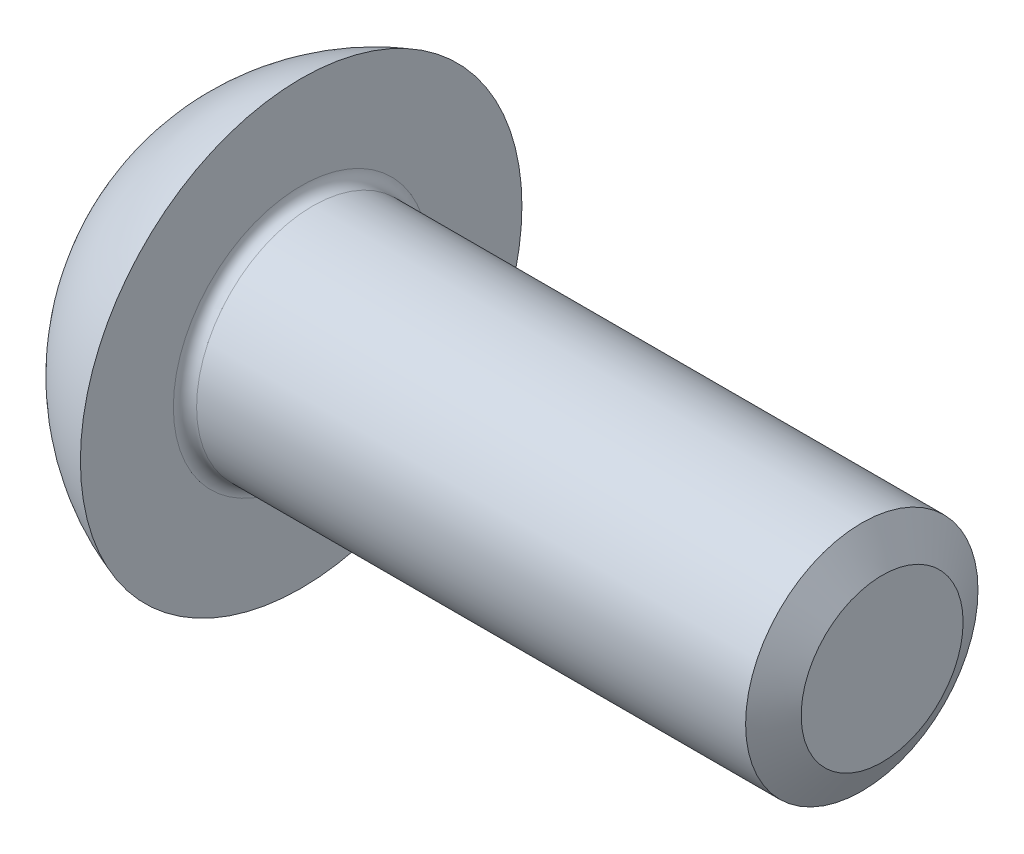
ISO-10303-21;
HEADER;
FILE_DESCRIPTION(('STEP AP214'),'2;1');
FILE_NAME('part.step','',(''),(''),'','','');
FILE_SCHEMA(('AUTOMOTIVE_DESIGN { 1 0 10303 214 1 1 1 1 }'));
ENDSEC;
DATA;
#1=APPLICATION_CONTEXT('core data for automotive mechanical design processes');
#2=APPLICATION_PROTOCOL_DEFINITION('international standard','automotive_design',2000,#1);
#3=PRODUCT_CONTEXT('',#1,'mechanical');
#4=PRODUCT('Part','Part','',(#3));
#5=PRODUCT_RELATED_PRODUCT_CATEGORY('part','',(#4));
#6=PRODUCT_DEFINITION_FORMATION('','',#4);
#7=PRODUCT_DEFINITION_CONTEXT('part definition',#1,'design');
#8=PRODUCT_DEFINITION('design','',#6,#7);
#9=PRODUCT_DEFINITION_SHAPE('','',#8);
#10=(LENGTH_UNIT() NAMED_UNIT(*) SI_UNIT(.MILLI.,.METRE.));
#11=(NAMED_UNIT(*) PLANE_ANGLE_UNIT() SI_UNIT($,.RADIAN.));
#12=(NAMED_UNIT(*) SI_UNIT($,.STERADIAN.) SOLID_ANGLE_UNIT());
#13=UNCERTAINTY_MEASURE_WITH_UNIT(LENGTH_MEASURE(1.E-05),#10,'distance_accuracy_value','');
#14=(GEOMETRIC_REPRESENTATION_CONTEXT(3) GLOBAL_UNCERTAINTY_ASSIGNED_CONTEXT((#13)) GLOBAL_UNIT_ASSIGNED_CONTEXT((#10,
#11,#12)) REPRESENTATION_CONTEXT('',''));
#15=CARTESIAN_POINT('',(0.,0.,0.));
#16=DIRECTION('',(0.,0.,1.));
#17=DIRECTION('',(1.,0.,0.));
#18=AXIS2_PLACEMENT_3D('',#15,#16,#17);
#19=CARTESIAN_POINT('',(-12.2,0.,0.));
#20=DIRECTION('',(-1.,0.,0.));
#21=DIRECTION('',(0.,0.,-1.));
#22=AXIS2_PLACEMENT_3D('',#19,#20,#21);
#23=CYLINDRICAL_SURFACE('',#22,2.);
#24=CARTESIAN_POINT('',(-9.8,0.,0.));
#25=DIRECTION('',(1.,0.,0.));
#26=DIRECTION('',(0.,0.,-1.));
#27=AXIS2_PLACEMENT_3D('',#24,#25,#26);
#28=CIRCLE('',#27,2.);
#29=CARTESIAN_POINT('',(-9.8,0.,-2.));
#30=VERTEX_POINT('',#29);
#31=EDGE_CURVE('E185',#30,#30,#28,.T.);
#32=ORIENTED_EDGE('',*,*,#31,.T.);
#33=EDGE_LOOP('',(#32));
#34=FACE_BOUND('',#33,.T.);
#35=CARTESIAN_POINT('',(-0.35,0.,0.));
#36=DIRECTION('',(1.,0.,0.));
#37=DIRECTION('',(0.,0.,-1.));
#38=AXIS2_PLACEMENT_3D('',#35,#36,#37);
#39=CIRCLE('',#38,2.);
#40=CARTESIAN_POINT('',(-0.35,0.,-2.));
#41=VERTEX_POINT('',#40);
#42=EDGE_CURVE('E458',#41,#41,#39,.T.);
#43=ORIENTED_EDGE('',*,*,#42,.F.);
#44=EDGE_LOOP('',(#43));
#45=FACE_BOUND('',#44,.T.);
#46=ADVANCED_FACE('F43',(#34,#45),#23,.T.);
#47=CARTESIAN_POINT('',(-12.2,0.,0.));
#48=DIRECTION('',(1.,0.,0.));
#49=DIRECTION('',(0.,0.,1.));
#50=AXIS2_PLACEMENT_3D('',#47,#48,#49);
#51=PLANE('',#50);
#52=CARTESIAN_POINT('',(-12.2,0.,0.));
#53=DIRECTION('',(1.,0.,0.));
#54=DIRECTION('',(0.,0.,-1.));
#55=AXIS2_PLACEMENT_3D('',#52,#53,#54);
#56=CIRCLE('',#55,2.);
#57=CARTESIAN_POINT('',(-12.2,2.,0.));
#58=VERTEX_POINT('',#57);
#59=EDGE_CURVE('E177',#58,#58,#56,.T.);
#60=ORIENTED_EDGE('',*,*,#59,.F.);
#61=EDGE_LOOP('',(#60));
#62=FACE_BOUND('',#61,.T.);
#63=CARTESIAN_POINT('',(-12.2,0.,0.));
#64=DIRECTION('',(-1.,0.,0.));
#65=DIRECTION('',(0.,0.,1.));
#66=AXIS2_PLACEMENT_3D('',#63,#64,#65);
#67=CIRCLE('',#66,1.44337567297406);
#68=CARTESIAN_POINT('',(-12.2,-0.721687836487032,1.25));
#69=VERTEX_POINT('',#68);
#70=CARTESIAN_POINT('',(-12.2,-1.44337567297406,0.));
#71=VERTEX_POINT('',#70);
#72=EDGE_CURVE('E11',#69,#71,#67,.F.);
#73=ORIENTED_EDGE('',*,*,#72,.T.);
#74=CARTESIAN_POINT('',(-12.2,0.,0.));
#75=DIRECTION('',(1.,0.,0.));
#76=DIRECTION('',(0.,-1.,0.));
#77=AXIS2_PLACEMENT_3D('',#74,#75,#76);
#78=CIRCLE('',#77,1.44337567297406);
#79=CARTESIAN_POINT('',(-12.2,-0.721687836487031,-1.25));
#80=VERTEX_POINT('',#79);
#81=EDGE_CURVE('E212',#71,#80,#78,.T.);
#82=ORIENTED_EDGE('',*,*,#81,.T.);
#83=CARTESIAN_POINT('',(-12.2,0.721687836487032,-1.25));
#84=VERTEX_POINT('',#83);
#85=EDGE_CURVE('E52',#80,#84,#67,.F.);
#86=ORIENTED_EDGE('',*,*,#85,.T.);
#87=CARTESIAN_POINT('',(-12.2,1.44337567297406,0.));
#88=VERTEX_POINT('',#87);
#89=EDGE_CURVE('E291',#84,#88,#67,.F.);
#90=ORIENTED_EDGE('',*,*,#89,.T.);
#91=CARTESIAN_POINT('',(-12.2,0.721687836487032,1.25));
#92=VERTEX_POINT('',#91);
#93=EDGE_CURVE('E128',#88,#92,#67,.F.);
#94=ORIENTED_EDGE('',*,*,#93,.T.);
#95=EDGE_CURVE('E47',#92,#69,#67,.F.);
#96=ORIENTED_EDGE('',*,*,#95,.T.);
#97=EDGE_LOOP('',(#73,#82,#86,#90,#94,#96));
#98=FACE_BOUND('',#97,.T.);
#99=ADVANCED_FACE('F45',(#62,#98),#51,.F.);
#100=CARTESIAN_POINT('',(-8.72727272727273,0.,0.));
#101=DIRECTION('',(-1.,0.,0.));
#102=DIRECTION('',(0.,1.,0.));
#103=AXIS2_PLACEMENT_3D('',#100,#101,#102);
#104=SPHERICAL_SURFACE('',#103,4.00747235932374);
#105=CARTESIAN_POINT('',(-10.,0.,0.));
#106=DIRECTION('',(1.,0.,0.));
#107=DIRECTION('',(0.,0.,-1.));
#108=AXIS2_PLACEMENT_3D('',#105,#106,#107);
#109=CIRCLE('',#108,3.8);
#110=CARTESIAN_POINT('',(-10.,3.8,0.));
#111=VERTEX_POINT('',#110);
#112=EDGE_CURVE('E180',#111,#111,#109,.T.);
#113=CARTESIAN_POINT('',(-12.2,2.,0.));
#114=CARTESIAN_POINT('',(-12.1848940441993,2.0262295590073,0.));
#115=CARTESIAN_POINT('',(-12.1694908144314,2.05228791024858,0.));
#116=CARTESIAN_POINT('',(-12.1380979525594,2.10404896261472,0.));
#117=CARTESIAN_POINT('',(-12.1221083204554,2.12975166373958,0.));
#118=CARTESIAN_POINT('',(-12.0895507995097,2.18078818128853,0.));
#119=CARTESIAN_POINT('',(-12.072982910668,2.20612199771262,0.));
#120=CARTESIAN_POINT('',(-12.0392773993975,2.25640774959029,0.));
#121=CARTESIAN_POINT('',(-12.0221397769687,2.28135968504386,0.));
#122=CARTESIAN_POINT('',(-11.9873035925655,2.33086886166223,0.));
#123=CARTESIAN_POINT('',(-11.9696050305911,2.35542610282703,0.));
#124=CARTESIAN_POINT('',(-11.9336560549214,2.40413328370188,0.));
#125=CARTESIAN_POINT('',(-11.9154056412261,2.42828322341193,0.));
#126=CARTESIAN_POINT('',(-11.8783623317131,2.47616340238235,0.));
#127=CARTESIAN_POINT('',(-11.8595694358953,2.49989364164271,0.));
#128=CARTESIAN_POINT('',(-11.8214508106667,2.54692223644896,0.));
#129=CARTESIAN_POINT('',(-11.8021250812559,2.57022059199485,0.));
#130=CARTESIAN_POINT('',(-11.7629507108208,2.61637345777279,0.));
#131=CARTESIAN_POINT('',(-11.7431020697966,2.63922796800483,0.));
#132=CARTESIAN_POINT('',(-11.7028920666117,2.68448140944799,0.));
#133=CARTESIAN_POINT('',(-11.682530704451,2.7068803406591,0.));
#134=CARTESIAN_POINT('',(-11.6413057126977,2.75121112424681,0.));
#135=CARTESIAN_POINT('',(-11.6204420831052,2.77314297662341,0.));
#136=CARTESIAN_POINT('',(-11.5782232680636,2.81652834253227,0.));
#137=CARTESIAN_POINT('',(-11.5568680826145,2.83798185606454,0.));
#138=CARTESIAN_POINT('',(-11.5136771198039,2.88039952985806,0.));
#139=CARTESIAN_POINT('',(-11.4918413424423,2.9013636901193,0.));
#140=CARTESIAN_POINT('',(-11.447700406491,2.94279189418253,0.));
#141=CARTESIAN_POINT('',(-11.4253952479013,2.96325593798452,0.));
#142=CARTESIAN_POINT('',(-11.3803270011625,3.00367340270524,0.));
#143=CARTESIAN_POINT('',(-11.3575639130134,3.02362682362398,0.));
#144=CARTESIAN_POINT('',(-11.3115914939299,3.06301279831263,0.));
#145=CARTESIAN_POINT('',(-11.2883821629955,3.08244535208254,0.));
#146=CARTESIAN_POINT('',(-11.2415291742204,3.12077961562579,0.));
#147=CARTESIAN_POINT('',(-11.2178855163797,3.13968132539914,0.));
#148=CARTESIAN_POINT('',(-11.1701760126585,3.17694419664163,0.));
#149=CARTESIAN_POINT('',(-11.1461101667779,3.19530535811077,0.));
#150=CARTESIAN_POINT('',(-11.0975686425984,3.23147770595957,0.));
#151=CARTESIAN_POINT('',(-11.0730929642995,3.24928889233922,0.));
#152=CARTESIAN_POINT('',(-11.0237443413165,3.2843521455859,0.));
#153=CARTESIAN_POINT('',(-10.9988713966324,3.30160421245294,0.));
#154=CARTESIAN_POINT('',(-10.9487410108723,3.3355403693082,0.));
#155=CARTESIAN_POINT('',(-10.9234835697963,3.35222445929642,0.));
#156=CARTESIAN_POINT('',(-10.8725971586496,3.38501609663248,0.));
#157=CARTESIAN_POINT('',(-10.846968188579,3.40112364398031,0.));
#158=CARTESIAN_POINT('',(-10.7953518775865,3.43275392627554,0.));
#159=CARTESIAN_POINT('',(-10.7693645366645,3.44827666122294,0.));
#160=CARTESIAN_POINT('',(-10.7170448261044,3.47872934920754,0.));
#161=CARTESIAN_POINT('',(-10.6907124564662,3.49365930224475,0.));
#162=CARTESIAN_POINT('',(-10.6377162077463,3.52291876123,0.));
#163=CARTESIAN_POINT('',(-10.6110523286645,3.53724826717803,0.));
#164=CARTESIAN_POINT('',(-10.5574067505418,3.56529947511373,0.));
#165=CARTESIAN_POINT('',(-10.5304250515009,3.57902117710138,0.));
#166=CARTESIAN_POINT('',(-10.4761576860719,3.60584973217452,0.));
#167=CARTESIAN_POINT('',(-10.4488720196837,3.61895658526,0.));
#168=CARTESIAN_POINT('',(-10.3940107283966,3.6445487137135,0.));
#169=CARTESIAN_POINT('',(-10.3664351034975,3.65703398908152,0.));
#170=CARTESIAN_POINT('',(-10.3110080522769,3.6813765507008,0.));
#171=CARTESIAN_POINT('',(-10.2831566259553,3.69323383695206,0.));
#172=CARTESIAN_POINT('',(-10.2271922728732,3.71631433772655,0.));
#173=CARTESIAN_POINT('',(-10.1990793461126,3.72753755224977,0.));
#174=CARTESIAN_POINT('',(-10.1426064188229,3.74934412871163,0.));
#175=CARTESIAN_POINT('',(-10.1142464182938,3.75992749065027,0.));
#176=CARTESIAN_POINT('',(-10.0572939289701,3.78044899835327,0.));
#177=CARTESIAN_POINT('',(-10.0287014401756,3.79038714411762,0.));
#178=CARTESIAN_POINT('',(-10.,3.8,0.));
#179=B_SPLINE_CURVE_WITH_KNOTS('',3,(#113,#114,#115,#116,#117,#118,#119,#120,#121,#122,#123,
#124,#125,#126,#127,#128,#129,#130,#131,#132,#133,#134,#135,#136,#137,#138,#139,#140,#141,#142,
#143,#144,#145,#146,#147,#148,#149,#150,#151,#152,#153,#154,#155,#156,#157,#158,#159,#160,#161,
#162,#163,#164,#165,#166,#167,#168,#169,#170,#171,#172,#173,#174,#175,#176,#177,#178),
.UNSPECIFIED.,.F.,.F.,(4,2,2,2,2,2,2,2,2,2,2,2,2,2,2,2,2,2,2,2,2,2,2,2,2,2,2,2,2,2,2,2,4),(0.,
0.0908034330338802,0.181606866067759,0.272410299101638,0.363213732135518,0.454017165169397,
0.544820598203277,0.635624031237157,0.726427464271037,0.817230897304915,0.908034330338795,
0.998837763372674,1.08964119640655,1.18044462944043,1.27124806247431,1.36205149550819,
1.45285492854207,1.54365836157595,1.63446179460983,1.72526522764371,1.81606866067759,
1.90687209371147,1.99767552674535,2.08847895977923,2.17928239281311,2.27008582584699,
2.36088925888087,2.45169269191475,2.54249612494863,2.63329955798251,2.72410299101639,
2.81490642405027,2.90570985708414),.UNSPECIFIED.);
#180=EDGE_CURVE('BSEAM156',#58,#111,#179,.T.);
#181=ORIENTED_EDGE('',*,*,#59,.T.);
#182=ORIENTED_EDGE('',*,*,#112,.F.);
#183=ORIENTED_EDGE('',*,*,#180,.T.);
#184=ORIENTED_EDGE('',*,*,#180,.F.);
#185=EDGE_LOOP('',(#181,#183,#182,#184));
#186=FACE_BOUND('',#185,.T.);
#187=ADVANCED_FACE('F156',(#186),#104,.T.);
#188=CARTESIAN_POINT('',(-10.,2.2,0.));
#189=DIRECTION('',(-1.,0.,0.));
#190=DIRECTION('',(0.,0.,-1.));
#191=AXIS2_PLACEMENT_3D('',#188,#189,#190);
#192=PLANE('',#191);
#193=ORIENTED_EDGE('',*,*,#112,.T.);
#194=EDGE_LOOP('',(#193));
#195=FACE_BOUND('',#194,.T.);
#196=CARTESIAN_POINT('',(-10.,0.,0.));
#197=DIRECTION('',(1.,0.,0.));
#198=DIRECTION('',(0.,0.,-1.));
#199=AXIS2_PLACEMENT_3D('',#196,#197,#198);
#200=CIRCLE('',#199,2.2);
#201=CARTESIAN_POINT('',(-10.,0.,-2.2));
#202=VERTEX_POINT('',#201);
#203=EDGE_CURVE('E181',#202,#202,#200,.T.);
#204=ORIENTED_EDGE('',*,*,#203,.F.);
#205=EDGE_LOOP('',(#204));
#206=FACE_BOUND('',#205,.T.);
#207=ADVANCED_FACE('F166',(#195,#206),#192,.F.);
#208=CARTESIAN_POINT('',(-9.8,0.,0.));
#209=DIRECTION('',(-1.,0.,0.));
#210=DIRECTION('',(0.,0.,-1.));
#211=AXIS2_PLACEMENT_3D('',#208,#209,#210);
#212=TOROIDAL_SURFACE('',#211,2.2,0.200000000000001);
#213=ORIENTED_EDGE('',*,*,#203,.T.);
#214=EDGE_LOOP('',(#213));
#215=FACE_BOUND('',#214,.T.);
#216=ORIENTED_EDGE('',*,*,#31,.F.);
#217=EDGE_LOOP('',(#216));
#218=FACE_BOUND('',#217,.T.);
#219=ADVANCED_FACE('F149',(#215,#218),#212,.F.);
#220=CARTESIAN_POINT('',(-11.83,0.,0.));
#221=DIRECTION('',(-1.,0.,0.));
#222=DIRECTION('',(0.,-1.,0.));
#223=AXIS2_PLACEMENT_3D('',#220,#221,#222);
#224=CONICAL_SURFACE('',#223,0.,1.31985626102756);
#225=CARTESIAN_POINT('',(-12.4099346759325,-1.885644561076,1.25));
#226=CARTESIAN_POINT('',(-12.3978717207476,-1.8291770874165,1.25));
#227=CARTESIAN_POINT('',(-12.3859628503841,-1.7726766725723,1.25));
#228=CARTESIAN_POINT('',(-12.3625309817374,-1.65959353753871,1.25));
#229=CARTESIAN_POINT('',(-12.3510079994509,-1.60301081403847,1.25));
#230=CARTESIAN_POINT('',(-12.3171150455956,-1.43301680255399,1.25));
#231=CARTESIAN_POINT('',(-12.2954436732229,-1.31946408423816,1.25));
#232=CARTESIAN_POINT('',(-12.2550957638519,-1.09274070822473,1.25));
#233=CARTESIAN_POINT('',(-12.2363969731627,-0.97957409090879,1.25));
#234=CARTESIAN_POINT('',(-12.2032623365578,-0.752620098767597,1.25));
#235=CARTESIAN_POINT('',(-12.188825705465,-0.638832842215426,1.25));
#236=CARTESIAN_POINT('',(-12.1660896767959,-0.409425109570646,1.25));
#237=CARTESIAN_POINT('',(-12.1578544497063,-0.293797778292055,1.25));
#238=CARTESIAN_POINT('',(-12.1515679025376,-0.12016451287169,1.25));
#239=CARTESIAN_POINT('',(-12.150483164521,-0.0622627928697091,1.25));
#240=CARTESIAN_POINT('',(-12.1503795328621,0.0535425643634299,1.25));
#241=CARTESIAN_POINT('',(-12.1513606413601,0.111446201596512,1.25));
#242=CARTESIAN_POINT('',(-12.1573598650309,0.28547429561123,1.25));
#243=CARTESIAN_POINT('',(-12.1654487463646,0.401498867331898,1.25));
#244=CARTESIAN_POINT('',(-12.1881044285101,0.632939913567424,1.25));
#245=CARTESIAN_POINT('',(-12.2026754362751,0.748355943831217,1.25));
#246=CARTESIAN_POINT('',(-12.2365518645336,0.980878548339567,1.25));
#247=CARTESIAN_POINT('',(-12.2559479393881,1.09797147869704,1.25));
#248=CARTESIAN_POINT('',(-12.297694705209,1.33163516353436,1.25));
#249=CARTESIAN_POINT('',(-12.3200458280349,1.44820583911092,1.25));
#250=CARTESIAN_POINT('',(-12.3666691464558,1.68099121637416,1.25));
#251=CARTESIAN_POINT('',(-12.3909418646374,1.79720581223611,1.25));
#252=CARTESIAN_POINT('',(-12.4407644332086,2.02936144854685,1.25));
#253=CARTESIAN_POINT('',(-12.4663143094331,2.14530248341221,1.25));
#254=CARTESIAN_POINT('',(-12.518006571917,2.37571314631909,1.25));
#255=CARTESIAN_POINT('',(-12.5441393559518,2.49018493743663,1.25));
#256=CARTESIAN_POINT('',(-12.5970181249123,2.71898894131966,1.25));
#257=CARTESIAN_POINT('',(-12.6237641225282,2.83332115114489,1.25));
#258=CARTESIAN_POINT('',(-12.6776683130688,3.06173187864781,1.25));
#259=CARTESIAN_POINT('',(-12.7048259274931,3.17581053313172,1.25));
#260=CARTESIAN_POINT('',(-12.7594820608418,3.40388218743046,1.25));
#261=CARTESIAN_POINT('',(-12.7869805683896,3.51787518996983,1.25));
#262=CARTESIAN_POINT('',(-12.8145979060137,3.63183906574753,1.25));
#263=B_SPLINE_CURVE_WITH_KNOTS('',3,(#225,#226,#227,#228,#229,#230,#231,#232,#233,#234,#235,
#236,#237,#238,#239,#240,#241,#242,#243,#244,#245,#246,#247,#248,#249,#250,#251,#252,#253,#254,
#255,#256,#257,#258,#259,#260,#261,#262),.UNSPECIFIED.,.F.,.F.,(4,2,2,2,2,2,2,2,2,2,2,2,2,2,2,2,
2,2,4),(0.,0.173224298995285,0.346455770019722,0.693239171189212,1.03728991141696,
1.38127723083866,1.72877689604067,1.90247833739644,2.07617995870963,2.42483219738436,
2.77371104508349,3.12971850144866,3.48577804345035,3.84193475233927,4.19809866864178,
4.55034691705482,4.90260246171338,5.25440194240088,5.60618971383707),.UNSPECIFIED.);
#264=EDGE_CURVE('E105',#69,#92,#263,.T.);
#265=ORIENTED_EDGE('',*,*,#264,.F.);
#266=ORIENTED_EDGE('',*,*,#95,.F.);
#267=EDGE_LOOP('',(#265,#266));
#268=FACE_BOUND('',#267,.T.);
#269=ADVANCED_FACE('F120',(#268),#224,.F.);
#270=CARTESIAN_POINT('',(-12.2000296035517,0.721572366433194,1.2502));
#271=CARTESIAN_POINT('',(-12.1923376245114,0.751560236122211,1.19825948608787));
#272=CARTESIAN_POINT('',(-12.1853558988612,0.781597955311093,1.14623263030924));
#273=CARTESIAN_POINT('',(-12.1730912390252,0.841770545746215,1.04201064645257));
#274=CARTESIAN_POINT('',(-12.1678089341386,0.871905448817342,0.989815463252219));
#275=CARTESIAN_POINT('',(-12.1592477971586,0.932104975245319,0.885546824887377));
#276=CARTESIAN_POINT('',(-12.1559596086559,0.96216925702196,0.833473961357168));
#277=CARTESIAN_POINT('',(-12.1515506008694,1.0223329488635,0.729267390316703));
#278=CARTESIAN_POINT('',(-12.1504293994002,1.05243235179702,0.677133695158352));
#279=CARTESIAN_POINT('',(-12.1504293994002,1.11263115766407,0.572866304841649));
#280=CARTESIAN_POINT('',(-12.1515506008694,1.1427305605976,0.520732609683297));
#281=CARTESIAN_POINT('',(-12.1559596086559,1.20289425243914,0.416526038642832));
#282=CARTESIAN_POINT('',(-12.1592477971586,1.23295853421578,0.364453175112624));
#283=CARTESIAN_POINT('',(-12.1678089341386,1.29315806064375,0.260184536747781));
#284=CARTESIAN_POINT('',(-12.1730912390252,1.32329296371488,0.207989353547427));
#285=CARTESIAN_POINT('',(-12.1853558988612,1.38346555415,0.103767369690763));
#286=CARTESIAN_POINT('',(-12.1923376245114,1.41350327333889,0.0517405139121316));
#287=CARTESIAN_POINT('',(-12.2000296035517,1.4434911430279,-0.000199999999999756));
#288=B_SPLINE_CURVE_WITH_KNOTS('',3,(#270,#271,#272,#273,#274,#275,#276,#277,#278,#279,#280,
#281,#282,#283,#284,#285,#286,#287),.UNSPECIFIED.,.F.,.F.,(4,2,2,2,2,2,2,2,4),(0.,
0.181409592460798,0.362886284169927,0.543504761741732,0.724091381228726,0.904678000715721,
1.08529647828753,1.26677316999666,1.44818276245745),.UNSPECIFIED.);
#289=EDGE_CURVE('E122',#92,#88,#288,.T.);
#290=ORIENTED_EDGE('',*,*,#289,.F.);
#291=ORIENTED_EDGE('',*,*,#93,.F.);
#292=EDGE_LOOP('',(#290,#291));
#293=FACE_BOUND('',#292,.T.);
#294=ADVANCED_FACE('F148',(#293),#224,.F.);
#295=CARTESIAN_POINT('',(-12.2000296035517,1.4434911430279,0.000200000000000031));
#296=CARTESIAN_POINT('',(-12.1923376245114,1.41350327333889,-0.0517405139121313));
#297=CARTESIAN_POINT('',(-12.1853558988612,1.38346555415,-0.103767369690762));
#298=CARTESIAN_POINT('',(-12.1730912390252,1.32329296371488,-0.207989353547427));
#299=CARTESIAN_POINT('',(-12.1678089341386,1.29315806064375,-0.260184536747781));
#300=CARTESIAN_POINT('',(-12.1592477971586,1.23295853421578,-0.364453175112623));
#301=CARTESIAN_POINT('',(-12.1559596086559,1.20289425243914,-0.416526038642832));
#302=CARTESIAN_POINT('',(-12.1515506008694,1.1427305605976,-0.520732609683297));
#303=CARTESIAN_POINT('',(-12.1504293994002,1.11263115766407,-0.572866304841648));
#304=CARTESIAN_POINT('',(-12.1504293994002,1.05243235179702,-0.677133695158351));
#305=CARTESIAN_POINT('',(-12.1515506008694,1.0223329488635,-0.729267390316703));
#306=CARTESIAN_POINT('',(-12.1559596086559,0.96216925702196,-0.833473961357168));
#307=CARTESIAN_POINT('',(-12.1592477971586,0.93210497524532,-0.885546824887376));
#308=CARTESIAN_POINT('',(-12.1678089341386,0.871905448817342,-0.989815463252219));
#309=CARTESIAN_POINT('',(-12.1730912390252,0.841770545746216,-1.04201064645257));
#310=CARTESIAN_POINT('',(-12.1853558988612,0.781597955311094,-1.14623263030924));
#311=CARTESIAN_POINT('',(-12.1923376245114,0.751560236122211,-1.19825948608787));
#312=CARTESIAN_POINT('',(-12.2000296035517,0.721572366433195,-1.2502));
#313=B_SPLINE_CURVE_WITH_KNOTS('',3,(#295,#296,#297,#298,#299,#300,#301,#302,#303,#304,#305,
#306,#307,#308,#309,#310,#311,#312),.UNSPECIFIED.,.F.,.F.,(4,2,2,2,2,2,2,2,4),(0.,
0.181409592460797,0.362886284169926,0.543504761741732,0.724091381228726,0.904678000715721,
1.08529647828753,1.26677316999665,1.44818276245745),.UNSPECIFIED.);
#314=EDGE_CURVE('E277',#88,#84,#313,.T.);
#315=ORIENTED_EDGE('',*,*,#314,.F.);
#316=ORIENTED_EDGE('',*,*,#89,.F.);
#317=EDGE_LOOP('',(#315,#316));
#318=FACE_BOUND('',#317,.T.);
#319=ADVANCED_FACE('F144',(#318),#224,.F.);
#320=CARTESIAN_POINT('',(-12.4099346759325,-1.885644561076,-1.25));
#321=CARTESIAN_POINT('',(-12.3978717207476,-1.8291770874165,-1.25));
#322=CARTESIAN_POINT('',(-12.3859628503841,-1.7726766725723,-1.25));
#323=CARTESIAN_POINT('',(-12.3625309817374,-1.65959353753871,-1.25));
#324=CARTESIAN_POINT('',(-12.3510079994509,-1.60301081403847,-1.25));
#325=CARTESIAN_POINT('',(-12.3171150455956,-1.43301680255399,-1.25));
#326=CARTESIAN_POINT('',(-12.2954436732229,-1.31946408423817,-1.25));
#327=CARTESIAN_POINT('',(-12.2550957638519,-1.09274070822473,-1.25));
#328=CARTESIAN_POINT('',(-12.2363969731627,-0.97957409090879,-1.25));
#329=CARTESIAN_POINT('',(-12.2032623365578,-0.752620098767597,-1.25));
#330=CARTESIAN_POINT('',(-12.188825705465,-0.638832842215426,-1.25));
#331=CARTESIAN_POINT('',(-12.1660896767959,-0.409425109570646,-1.25));
#332=CARTESIAN_POINT('',(-12.1578544497063,-0.293797778292056,-1.25));
#333=CARTESIAN_POINT('',(-12.1515679025376,-0.120164512871691,-1.25));
#334=CARTESIAN_POINT('',(-12.150483164521,-0.0622627928697096,-1.25));
#335=CARTESIAN_POINT('',(-12.1503795328621,0.0535425643634294,-1.25));
#336=CARTESIAN_POINT('',(-12.1513606413601,0.111446201596511,-1.25));
#337=CARTESIAN_POINT('',(-12.1573598650309,0.285474295611229,-1.25));
#338=CARTESIAN_POINT('',(-12.1654487463646,0.401498867331898,-1.25));
#339=CARTESIAN_POINT('',(-12.1881044285101,0.632939913567424,-1.25));
#340=CARTESIAN_POINT('',(-12.2026754362751,0.748355943831216,-1.25));
#341=CARTESIAN_POINT('',(-12.2365518645336,0.980878548339567,-1.25));
#342=CARTESIAN_POINT('',(-12.2559479393881,1.09797147869704,-1.25));
#343=CARTESIAN_POINT('',(-12.297694705209,1.33163516353436,-1.25));
#344=CARTESIAN_POINT('',(-12.3200458280349,1.44820583911092,-1.25));
#345=CARTESIAN_POINT('',(-12.3666691464558,1.68099121637416,-1.25));
#346=CARTESIAN_POINT('',(-12.3909418646374,1.79720581223611,-1.25));
#347=CARTESIAN_POINT('',(-12.4407644332086,2.02936144854685,-1.25));
#348=CARTESIAN_POINT('',(-12.4663143094331,2.14530248341221,-1.25));
#349=CARTESIAN_POINT('',(-12.518006571917,2.37571314631909,-1.25));
#350=CARTESIAN_POINT('',(-12.5441393559518,2.49018493743663,-1.25));
#351=CARTESIAN_POINT('',(-12.5970181249123,2.71898894131966,-1.25));
#352=CARTESIAN_POINT('',(-12.6237641225282,2.83332115114489,-1.25));
#353=CARTESIAN_POINT('',(-12.6776683130688,3.06173187864781,-1.25));
#354=CARTESIAN_POINT('',(-12.7048259274931,3.17581053313172,-1.25));
#355=CARTESIAN_POINT('',(-12.7594820608418,3.40388218743046,-1.25));
#356=CARTESIAN_POINT('',(-12.7869805683896,3.51787518996983,-1.25));
#357=CARTESIAN_POINT('',(-12.8145979060137,3.63183906574753,-1.25));
#358=B_SPLINE_CURVE_WITH_KNOTS('',3,(#320,#321,#322,#323,#324,#325,#326,#327,#328,#329,#330,
#331,#332,#333,#334,#335,#336,#337,#338,#339,#340,#341,#342,#343,#344,#345,#346,#347,#348,#349,
#350,#351,#352,#353,#354,#355,#356,#357),.UNSPECIFIED.,.F.,.F.,(4,2,2,2,2,2,2,2,2,2,2,2,2,2,2,2,
2,2,4),(0.,0.173224298995285,0.346455770019722,0.693239171189212,1.03728991141696,
1.38127723083866,1.72877689604067,1.90247833739644,2.07617995870963,2.42483219738436,
2.77371104508349,3.12971850144866,3.48577804345035,3.84193475233927,4.19809866864178,
4.55034691705482,4.90260246171338,5.25440194240088,5.60618971383707),.UNSPECIFIED.);
#359=EDGE_CURVE('E271',#84,#80,#358,.F.);
#360=ORIENTED_EDGE('',*,*,#359,.F.);
#361=ORIENTED_EDGE('',*,*,#85,.F.);
#362=EDGE_LOOP('',(#360,#361));
#363=FACE_BOUND('',#362,.T.);
#364=ADVANCED_FACE('F142',(#363),#224,.F.);
#365=CARTESIAN_POINT('',(-12.2000296035517,-0.721572366433195,-1.2502));
#366=CARTESIAN_POINT('',(-12.1923376245114,-0.751560236122212,-1.19825948608787));
#367=CARTESIAN_POINT('',(-12.1853558988612,-0.781597955311094,-1.14623263030924));
#368=CARTESIAN_POINT('',(-12.1730912390252,-0.841770545746216,-1.04201064645257));
#369=CARTESIAN_POINT('',(-12.1678089341386,-0.871905448817343,-0.989815463252219));
#370=CARTESIAN_POINT('',(-12.1592477971586,-0.93210497524532,-0.885546824887376));
#371=CARTESIAN_POINT('',(-12.1559596086559,-0.962169257021961,-0.833473961357168));
#372=CARTESIAN_POINT('',(-12.1515506008694,-1.0223329488635,-0.729267390316703));
#373=CARTESIAN_POINT('',(-12.1504293994002,-1.05243235179702,-0.677133695158351));
#374=CARTESIAN_POINT('',(-12.1504293994002,-1.11263115766407,-0.572866304841648));
#375=CARTESIAN_POINT('',(-12.1515506008694,-1.1427305605976,-0.520732609683297));
#376=CARTESIAN_POINT('',(-12.1559596086559,-1.20289425243914,-0.416526038642831));
#377=CARTESIAN_POINT('',(-12.1592477971586,-1.23295853421578,-0.364453175112623));
#378=CARTESIAN_POINT('',(-12.1678089341386,-1.29315806064376,-0.260184536747781));
#379=CARTESIAN_POINT('',(-12.1730912390252,-1.32329296371488,-0.207989353547427));
#380=CARTESIAN_POINT('',(-12.1853558988612,-1.38346555415,-0.103767369690762));
#381=CARTESIAN_POINT('',(-12.1923376245114,-1.41350327333889,-0.0517405139121309));
#382=CARTESIAN_POINT('',(-12.2000296035517,-1.4434911430279,0.000200000000000191));
#383=B_SPLINE_CURVE_WITH_KNOTS('',3,(#365,#366,#367,#368,#369,#370,#371,#372,#373,#374,#375,
#376,#377,#378,#379,#380,#381,#382),.UNSPECIFIED.,.F.,.F.,(4,2,2,2,2,2,2,2,4),(0.,
0.181409592460797,0.362886284169926,0.543504761741732,0.724091381228726,0.904678000715721,
1.08529647828753,1.26677316999666,1.44818276245745),.UNSPECIFIED.);
#384=EDGE_CURVE('E116',#80,#71,#383,.T.);
#385=ORIENTED_EDGE('',*,*,#384,.F.);
#386=ORIENTED_EDGE('',*,*,#81,.F.);
#387=EDGE_LOOP('',(#385,#386));
#388=FACE_BOUND('',#387,.T.);
#389=ADVANCED_FACE('F133',(#388),#224,.F.);
#390=CARTESIAN_POINT('',(-12.2000296035517,-1.4434911430279,-0.000199999999999413));
#391=CARTESIAN_POINT('',(-12.1923376245114,-1.41350327333889,0.0517405139121317));
#392=CARTESIAN_POINT('',(-12.1853558988612,-1.38346555415,0.103767369690763));
#393=CARTESIAN_POINT('',(-12.1730912390252,-1.32329296371488,0.207989353547427));
#394=CARTESIAN_POINT('',(-12.1678089341386,-1.29315806064376,0.260184536747781));
#395=CARTESIAN_POINT('',(-12.1592477971586,-1.23295853421578,0.364453175112624));
#396=CARTESIAN_POINT('',(-12.1559596086559,-1.20289425243914,0.416526038642832));
#397=CARTESIAN_POINT('',(-12.1515506008694,-1.1427305605976,0.520732609683297));
#398=CARTESIAN_POINT('',(-12.1504293994002,-1.11263115766407,0.572866304841649));
#399=CARTESIAN_POINT('',(-12.1504293994002,-1.05243235179702,0.677133695158352));
#400=CARTESIAN_POINT('',(-12.1515506008694,-1.0223329488635,0.729267390316703));
#401=CARTESIAN_POINT('',(-12.1559596086559,-0.96216925702196,0.833473961357168));
#402=CARTESIAN_POINT('',(-12.1592477971586,-0.93210497524532,0.885546824887376));
#403=CARTESIAN_POINT('',(-12.1678089341386,-0.871905448817343,0.989815463252219));
#404=CARTESIAN_POINT('',(-12.1730912390252,-0.841770545746216,1.04201064645257));
#405=CARTESIAN_POINT('',(-12.1853558988612,-0.781597955311094,1.14623263030924));
#406=CARTESIAN_POINT('',(-12.1923376245114,-0.751560236122212,1.19825948608787));
#407=CARTESIAN_POINT('',(-12.2000296035517,-0.721572366433195,1.2502));
#408=B_SPLINE_CURVE_WITH_KNOTS('',3,(#390,#391,#392,#393,#394,#395,#396,#397,#398,#399,#400,
#401,#402,#403,#404,#405,#406,#407),.UNSPECIFIED.,.F.,.F.,(4,2,2,2,2,2,2,2,4),(0.,
0.181409592460797,0.362886284169926,0.543504761741732,0.724091381228726,0.904678000715721,
1.08529647828753,1.26677316999665,1.44818276245745),.UNSPECIFIED.);
#409=EDGE_CURVE('E112',#71,#69,#408,.T.);
#410=ORIENTED_EDGE('',*,*,#409,.F.);
#411=ORIENTED_EDGE('',*,*,#72,.F.);
#412=EDGE_LOOP('',(#410,#411));
#413=FACE_BOUND('',#412,.T.);
#414=ADVANCED_FACE('F130',(#413),#224,.F.);
#415=CARTESIAN_POINT('',(-10.9,0.,0.));
#416=DIRECTION('',(-1.,0.,0.));
#417=DIRECTION('',(0.,0.,-1.));
#418=AXIS2_PLACEMENT_3D('',#415,#416,#417);
#419=CONICAL_SURFACE('',#418,1.44337567297406,1.01324881882863);
#420=CARTESIAN_POINT('',(-10.,0.,0.));
#421=VERTEX_POINT('',#420);
#422=VERTEX_LOOP('',#421);
#423=FACE_BOUND('',#422,.T.);
#424=CARTESIAN_POINT('',(-11.3527945795421,-1.77325319370587,-1.25));
#425=CARTESIAN_POINT('',(-11.3272313608337,-1.72308054748254,-1.25));
#426=CARTESIAN_POINT('',(-11.3019425610441,-1.67276579739611,-1.25));
#427=CARTESIAN_POINT('',(-11.2520602884769,-1.57178113050657,-1.25));
#428=CARTESIAN_POINT('',(-11.2274669508561,-1.52111114702254,-1.25));
#429=CARTESIAN_POINT('',(-11.1789832389279,-1.41905106562435,-1.25));
#430=CARTESIAN_POINT('',(-11.1550981267071,-1.36765845463947,-1.25));
#431=CARTESIAN_POINT('',(-11.1084115654386,-1.26438731533743,-1.25));
#432=CARTESIAN_POINT('',(-11.0856100580289,-1.21250881337054,-1.25));
#433=CARTESIAN_POINT('',(-11.0180066296141,-1.05318865262781,-1.25));
#434=CARTESIAN_POINT('',(-10.975348048821,-0.944818595736523,-1.25));
#435=CARTESIAN_POINT('',(-10.899249765014,-0.725021793662277,-1.25));
#436=CARTESIAN_POINT('',(-10.8657864364544,-0.61360370625827,-1.25));
#437=CARTESIAN_POINT('',(-10.8255224000706,-0.439829475428556,-1.25));
#438=CARTESIAN_POINT('',(-10.8135539759356,-0.378686784718628,-1.25));
#439=CARTESIAN_POINT('',(-10.7946834115852,-0.255611326700576,-1.25));
#440=CARTESIAN_POINT('',(-10.7877804723348,-0.193678685568829,-1.25));
#441=CARTESIAN_POINT('',(-10.7797277447971,-0.0702459018996856,-1.25));
#442=CARTESIAN_POINT('',(-10.7785036595021,-0.00875074655362739,-1.25));
#443=CARTESIAN_POINT('',(-10.7817252928589,0.114091468273713,-1.25));
#444=CARTESIAN_POINT('',(-10.7861717520863,0.175438507362528,-1.25));
#445=CARTESIAN_POINT('',(-10.802790821166,0.318793774562431,-1.25));
#446=CARTESIAN_POINT('',(-10.8171162097553,0.40055050780021,-1.25));
#447=CARTESIAN_POINT('',(-10.8533604743273,0.562357759535309,-1.25));
#448=CARTESIAN_POINT('',(-10.8752859853004,0.642406722094853,-1.25));
#449=CARTESIAN_POINT('',(-10.9252263796581,0.802612605575798,-1.25));
#450=CARTESIAN_POINT('',(-10.9533725953862,0.88272761011228,-1.25));
#451=CARTESIAN_POINT('',(-11.0137044102596,1.04136692759758,-1.25));
#452=CARTESIAN_POINT('',(-11.0458888175979,1.11989170196819,-1.25));
#453=CARTESIAN_POINT('',(-11.1085113010088,1.26504456834479,-1.25));
#454=CARTESIAN_POINT('',(-11.1385863298607,1.33183108575291,-1.25));
#455=CARTESIAN_POINT('',(-11.2003370421044,1.46466259424516,-1.25));
#456=CARTESIAN_POINT('',(-11.2320128472902,1.53070752843773,-1.25));
#457=CARTESIAN_POINT('',(-11.3288612944515,1.72800114412657,-1.25));
#458=CARTESIAN_POINT('',(-11.3958346146514,1.85836304165699,-1.25));
#459=CARTESIAN_POINT('',(-11.5327729293065,2.11775589592147,-1.25));
#460=CARTESIAN_POINT('',(-11.6027425964556,2.24678435317969,-1.25));
#461=CARTESIAN_POINT('',(-11.7445495255551,2.50377456749809,-1.25));
#462=CARTESIAN_POINT('',(-11.8163864088467,2.63173653399053,-1.25));
#463=CARTESIAN_POINT('',(-11.9535702802704,2.87326192040095,-1.25));
#464=CARTESIAN_POINT('',(-12.0187879458601,2.98689907544955,-1.25));
#465=CARTESIAN_POINT('',(-12.1499753350724,3.21374706697092,-1.25));
#466=CARTESIAN_POINT('',(-12.2159451030052,3.32695787779727,-1.25));
#467=CARTESIAN_POINT('',(-12.3482234067217,3.55267191020502,-1.25));
#468=CARTESIAN_POINT('',(-12.4145300682268,3.66517623176316,-1.25));
#469=CARTESIAN_POINT('',(-12.5475751113016,3.8899176768681,-1.25));
#470=CARTESIAN_POINT('',(-12.6143134591135,4.00215482039119,-1.25));
#471=CARTESIAN_POINT('',(-12.6812102093033,4.11429687203232,-1.25));
#472=B_SPLINE_CURVE_WITH_KNOTS('',3,(#424,#425,#426,#427,#428,#429,#430,#431,#432,#433,#434,
#435,#436,#437,#438,#439,#440,#441,#442,#443,#444,#445,#446,#447,#448,#449,#450,#451,#452,#453,
#454,#455,#456,#457,#458,#459,#460,#461,#462,#463,#464,#465,#466,#467,#468,#469,#470,#471),
.UNSPECIFIED.,.F.,.F.,(4,2,2,2,2,2,2,2,2,2,2,2,2,2,2,2,2,2,2,2,2,2,2,4),(0.,0.16893088808668,
0.337894383813143,0.50789846348262,0.67789337646512,1.0270708628597,1.3753426286684,
1.5620783253289,1.74878455976038,1.93304107769939,2.11732166208064,2.36583389677495,
2.61456363408265,2.86915526427585,3.12367193182966,3.34338375168395,3.56311231342189,
4.00271912781841,4.44303841363043,4.88326909182565,5.27633168545271,5.66941755741553,
6.06118706475326,6.45292629749501),.UNSPECIFIED.);
#473=CARTESIAN_POINT('',(-10.9,-0.721687836487033,-1.25));
#474=VERTEX_POINT('',#473);
#475=CARTESIAN_POINT('',(-10.9,0.721687836487032,-1.25));
#476=VERTEX_POINT('',#475);
#477=EDGE_CURVE('E253',#474,#476,#472,.T.);
#478=ORIENTED_EDGE('',*,*,#477,.F.);
#479=CARTESIAN_POINT('',(-10.9000720086393,-1.4434911430279,0.00020000000000068));
#480=CARTESIAN_POINT('',(-10.8801448426332,-1.41154811178317,-0.0551269530636319));
#481=CARTESIAN_POINT('',(-10.8620045541367,-1.37928346886239,-0.111010953890488));
#482=CARTESIAN_POINT('',(-10.8303569142874,-1.31409806872323,-0.223915378843221));
#483=CARTESIAN_POINT('',(-10.8168631745157,-1.28117567779349,-0.28093863264018));
#484=CARTESIAN_POINT('',(-10.7960025510557,-1.2158074622349,-0.394159703187767));
#485=CARTESIAN_POINT('',(-10.7884697729694,-1.18337538820199,-0.450333703207606));
#486=CARTESIAN_POINT('',(-10.7796634350083,-1.11834088983005,-0.562976758632573));
#487=CARTESIAN_POINT('',(-10.7783805168214,-1.08573879340658,-0.619445246071272));
#488=CARTESIAN_POINT('',(-10.7819049641254,-1.02538706759774,-0.723977501496652));
#489=CARTESIAN_POINT('',(-10.7858507725259,-0.997623697672098,-0.772065068797194));
#490=CARTESIAN_POINT('',(-10.7980757188124,-0.942309630835327,-0.867871842931743));
#491=CARTESIAN_POINT('',(-10.8063595984707,-0.914759200185472,-0.915590588587695));
#492=CARTESIAN_POINT('',(-10.826962668364,-0.859319190980461,-1.01161550130286));
#493=CARTESIAN_POINT('',(-10.8393795573722,-0.831438933466093,-1.05990552384585));
#494=CARTESIAN_POINT('',(-10.8674628627124,-0.776156193658105,-1.1556580379749));
#495=CARTESIAN_POINT('',(-10.8831216709794,-0.748752752743341,-1.20312218994148));
#496=CARTESIAN_POINT('',(-10.9000720086393,-0.721572366433195,-1.2502));
#497=B_SPLINE_CURVE_WITH_KNOTS('',3,(#479,#480,#481,#482,#483,#484,#485,#486,#487,#488,#489,
#490,#491,#492,#493,#494,#495,#496),.UNSPECIFIED.,.F.,.F.,(4,2,2,2,2,2,2,2,4),(0.,
0.200864252203225,0.402312007110812,0.597934215834185,0.79326341677952,0.960084042532228,
1.12708739503102,1.29835788316976,1.46923090317111),.UNSPECIFIED.);
#498=CARTESIAN_POINT('',(-10.9,-1.44337567297407,0.));
#499=VERTEX_POINT('',#498);
#500=EDGE_CURVE('E242',#499,#474,#497,.T.);
#501=ORIENTED_EDGE('',*,*,#500,.F.);
#502=CARTESIAN_POINT('',(-10.9000720086393,-0.721572366433195,1.2502));
#503=CARTESIAN_POINT('',(-10.8801448426332,-0.753515397677925,1.19487304693637));
#504=CARTESIAN_POINT('',(-10.8620045541367,-0.785780040598704,1.13898904610951));
#505=CARTESIAN_POINT('',(-10.8303569142874,-0.850965440737864,1.02608462115678));
#506=CARTESIAN_POINT('',(-10.8168631745157,-0.883887831667607,0.969061367359819));
#507=CARTESIAN_POINT('',(-10.7960025510557,-0.949256047226193,0.855840296812233));
#508=CARTESIAN_POINT('',(-10.7884697729694,-0.981688121259106,0.799666296792394));
#509=CARTESIAN_POINT('',(-10.7796634350083,-1.04672261963105,0.687023241367427));
#510=CARTESIAN_POINT('',(-10.7783805168214,-1.07932471605452,0.630554753928728));
#511=CARTESIAN_POINT('',(-10.7819049641254,-1.13967644186336,0.526022498503348));
#512=CARTESIAN_POINT('',(-10.7858507725259,-1.167439811789,0.477934931202806));
#513=CARTESIAN_POINT('',(-10.7980757188124,-1.22275387862577,0.382128157068257));
#514=CARTESIAN_POINT('',(-10.8063595984707,-1.25030430927563,0.334409411412305));
#515=CARTESIAN_POINT('',(-10.826962668364,-1.30574431848064,0.23838449869714));
#516=CARTESIAN_POINT('',(-10.8393795573722,-1.33362457599501,0.190094476154151));
#517=CARTESIAN_POINT('',(-10.8674628627124,-1.38890731580299,0.0943419620251049));
#518=CARTESIAN_POINT('',(-10.8831216709794,-1.41631075671776,0.046877810058522));
#519=CARTESIAN_POINT('',(-10.9000720086393,-1.4434911430279,-0.000199999999999629));
#520=B_SPLINE_CURVE_WITH_KNOTS('',3,(#502,#503,#504,#505,#506,#507,#508,#509,#510,#511,#512,
#513,#514,#515,#516,#517,#518,#519),.UNSPECIFIED.,.F.,.F.,(4,2,2,2,2,2,2,2,4),(0.,
0.200864252203225,0.402312007110812,0.597934215834185,0.79326341677952,0.960084042532227,
1.12708739503102,1.29835788316976,1.46923090317111),.UNSPECIFIED.);
#521=CARTESIAN_POINT('',(-10.9,-0.721687836487033,1.25));
#522=VERTEX_POINT('',#521);
#523=EDGE_CURVE('E235',#522,#499,#520,.T.);
#524=ORIENTED_EDGE('',*,*,#523,.F.);
#525=CARTESIAN_POINT('',(-11.3527945795421,-1.77325319370587,1.25));
#526=CARTESIAN_POINT('',(-11.3272313608337,-1.72308054748254,1.25));
#527=CARTESIAN_POINT('',(-11.3019425610441,-1.67276579739611,1.25));
#528=CARTESIAN_POINT('',(-11.2520602884769,-1.57178113050657,1.25));
#529=CARTESIAN_POINT('',(-11.2274669508561,-1.52111114702254,1.25));
#530=CARTESIAN_POINT('',(-11.1789832389279,-1.41905106562435,1.25));
#531=CARTESIAN_POINT('',(-11.1550981267071,-1.36765845463947,1.25));
#532=CARTESIAN_POINT('',(-11.1084115654387,-1.26438731533743,1.25));
#533=CARTESIAN_POINT('',(-11.0856100580289,-1.21250881337054,1.25));
#534=CARTESIAN_POINT('',(-11.0180066296141,-1.05318865262781,1.25));
#535=CARTESIAN_POINT('',(-10.975348048821,-0.944818595736524,1.25));
#536=CARTESIAN_POINT('',(-10.899249765014,-0.725021793662277,1.25));
#537=CARTESIAN_POINT('',(-10.8657864364544,-0.613603706258271,1.25));
#538=CARTESIAN_POINT('',(-10.8255224000706,-0.439829475428557,1.25));
#539=CARTESIAN_POINT('',(-10.8135539759356,-0.378686784718629,1.25));
#540=CARTESIAN_POINT('',(-10.7946834115852,-0.255611326700577,1.25));
#541=CARTESIAN_POINT('',(-10.7877804723348,-0.19367868556883,1.25));
#542=CARTESIAN_POINT('',(-10.7797277447971,-0.0702459018996856,1.25));
#543=CARTESIAN_POINT('',(-10.7785036595021,-0.00875074655362722,1.25));
#544=CARTESIAN_POINT('',(-10.7817252928589,0.114091468273714,1.25));
#545=CARTESIAN_POINT('',(-10.7861717520863,0.175438507362529,1.25));
#546=CARTESIAN_POINT('',(-10.802790821166,0.318793774562431,1.25));
#547=CARTESIAN_POINT('',(-10.8171162097553,0.400550507800212,1.25));
#548=CARTESIAN_POINT('',(-10.8533604743273,0.562357759535311,1.25));
#549=CARTESIAN_POINT('',(-10.8752859853004,0.642406722094855,1.25));
#550=CARTESIAN_POINT('',(-10.9252263796582,0.8026126055758,1.25));
#551=CARTESIAN_POINT('',(-10.9533725953862,0.882727610112282,1.25));
#552=CARTESIAN_POINT('',(-11.0137044102596,1.04136692759758,1.25));
#553=CARTESIAN_POINT('',(-11.0458888175979,1.11989170196819,1.25));
#554=CARTESIAN_POINT('',(-11.1085113010088,1.26504456834479,1.25));
#555=CARTESIAN_POINT('',(-11.1385863298607,1.33183108575291,1.25));
#556=CARTESIAN_POINT('',(-11.2003370421044,1.46466259424516,1.25));
#557=CARTESIAN_POINT('',(-11.2320128472902,1.53070752843774,1.25));
#558=CARTESIAN_POINT('',(-11.3288612944515,1.72800114412657,1.25));
#559=CARTESIAN_POINT('',(-11.3958346146514,1.85836304165698,1.25));
#560=CARTESIAN_POINT('',(-11.5327729293065,2.11775589592146,1.25));
#561=CARTESIAN_POINT('',(-11.6027425964556,2.24678435317969,1.25));
#562=CARTESIAN_POINT('',(-11.7445495255551,2.50377456749809,1.25));
#563=CARTESIAN_POINT('',(-11.8163864088467,2.63173653399052,1.25));
#564=CARTESIAN_POINT('',(-11.9535702802704,2.87326192040095,1.25));
#565=CARTESIAN_POINT('',(-12.0187879458601,2.98689907544954,1.25));
#566=CARTESIAN_POINT('',(-12.1499753350723,3.21374706697091,1.25));
#567=CARTESIAN_POINT('',(-12.2159451030052,3.32695787779727,1.25));
#568=CARTESIAN_POINT('',(-12.3482234067217,3.55267191020501,1.25));
#569=CARTESIAN_POINT('',(-12.4145300682268,3.66517623176316,1.25));
#570=CARTESIAN_POINT('',(-12.5475751113016,3.8899176768681,1.25));
#571=CARTESIAN_POINT('',(-12.6143134591135,4.00215482039119,1.25));
#572=CARTESIAN_POINT('',(-12.6812102093033,4.11429687203232,1.25));
#573=B_SPLINE_CURVE_WITH_KNOTS('',3,(#525,#526,#527,#528,#529,#530,#531,#532,#533,#534,#535,
#536,#537,#538,#539,#540,#541,#542,#543,#544,#545,#546,#547,#548,#549,#550,#551,#552,#553,#554,
#555,#556,#557,#558,#559,#560,#561,#562,#563,#564,#565,#566,#567,#568,#569,#570,#571,#572),
.UNSPECIFIED.,.F.,.F.,(4,2,2,2,2,2,2,2,2,2,2,2,2,2,2,2,2,2,2,2,2,2,2,4),(0.,0.16893088808668,
0.337894383813143,0.507898463482619,0.677893376465119,1.0270708628597,1.3753426286684,
1.56207832532889,1.74878455976038,1.93304107769939,2.11732166208064,2.36583389677495,
2.61456363408265,2.86915526427585,3.12367193182966,3.34338375168395,3.56311231342189,
4.0027191278184,4.44303841363042,4.88326909182565,5.2763316854527,5.66941755741552,
6.06118706475326,6.45292629749501),.UNSPECIFIED.);
#574=CARTESIAN_POINT('',(-10.9,0.721687836487033,1.25));
#575=VERTEX_POINT('',#574);
#576=EDGE_CURVE('E108',#575,#522,#573,.F.);
#577=ORIENTED_EDGE('',*,*,#576,.F.);
#578=CARTESIAN_POINT('',(-10.9000720086393,1.4434911430279,-0.000199999999999767));
#579=CARTESIAN_POINT('',(-10.8801448426332,1.41154811178317,0.0551269530636332));
#580=CARTESIAN_POINT('',(-10.8620045541367,1.37928346886239,0.111010953890489));
#581=CARTESIAN_POINT('',(-10.8303569142874,1.31409806872323,0.223915378843222));
#582=CARTESIAN_POINT('',(-10.8168631745157,1.28117567779349,0.280938632640181));
#583=CARTESIAN_POINT('',(-10.7960025510557,1.2158074622349,0.394159703187767));
#584=CARTESIAN_POINT('',(-10.7884697729694,1.18337538820199,0.450333703207607));
#585=CARTESIAN_POINT('',(-10.7796634350083,1.11834088983005,0.562976758632573));
#586=CARTESIAN_POINT('',(-10.7783805168214,1.08573879340658,0.619445246071272));
#587=CARTESIAN_POINT('',(-10.7819049641253,1.02538706759774,0.723977501496652));
#588=CARTESIAN_POINT('',(-10.7858507725259,0.997623697672097,0.772065068797194));
#589=CARTESIAN_POINT('',(-10.7980757188124,0.942309630835326,0.867871842931743));
#590=CARTESIAN_POINT('',(-10.8063595984707,0.914759200185471,0.915590588587695));
#591=CARTESIAN_POINT('',(-10.826962668364,0.85931919098046,1.01161550130286));
#592=CARTESIAN_POINT('',(-10.8393795573722,0.831438933466092,1.05990552384585));
#593=CARTESIAN_POINT('',(-10.8674628627124,0.776156193658104,1.1556580379749));
#594=CARTESIAN_POINT('',(-10.8831216709794,0.74875275274334,1.20312218994148));
#595=CARTESIAN_POINT('',(-10.9000720086393,0.721572366433194,1.2502));
#596=B_SPLINE_CURVE_WITH_KNOTS('',3,(#578,#579,#580,#581,#582,#583,#584,#585,#586,#587,#588,
#589,#590,#591,#592,#593,#594,#595),.UNSPECIFIED.,.F.,.F.,(4,2,2,2,2,2,2,2,4),(0.,
0.200864252203224,0.402312007110811,0.597934215834184,0.793263416779518,0.960084042532227,
1.12708739503102,1.29835788316976,1.46923090317111),.UNSPECIFIED.);
#597=CARTESIAN_POINT('',(-10.9,1.44337567297406,0.));
#598=VERTEX_POINT('',#597);
#599=EDGE_CURVE('E129',#598,#575,#596,.T.);
#600=ORIENTED_EDGE('',*,*,#599,.F.);
#601=CARTESIAN_POINT('',(-10.9000720086393,0.721572366433195,-1.2502));
#602=CARTESIAN_POINT('',(-10.8801448426332,0.753515397677925,-1.19487304693637));
#603=CARTESIAN_POINT('',(-10.8620045541367,0.785780040598703,-1.13898904610951));
#604=CARTESIAN_POINT('',(-10.8303569142874,0.850965440737863,-1.02608462115678));
#605=CARTESIAN_POINT('',(-10.8168631745157,0.883887831667606,-0.969061367359819));
#606=CARTESIAN_POINT('',(-10.7960025510557,0.949256047226193,-0.855840296812232));
#607=CARTESIAN_POINT('',(-10.7884697729694,0.981688121259105,-0.799666296792393));
#608=CARTESIAN_POINT('',(-10.7796634350083,1.04672261963105,-0.687023241367426));
#609=CARTESIAN_POINT('',(-10.7783805168214,1.07932471605452,-0.630554753928728));
#610=CARTESIAN_POINT('',(-10.7819049641253,1.13967644186336,-0.526022498503348));
#611=CARTESIAN_POINT('',(-10.7858507725259,1.167439811789,-0.477934931202806));
#612=CARTESIAN_POINT('',(-10.7980757188124,1.22275387862577,-0.382128157068257));
#613=CARTESIAN_POINT('',(-10.8063595984707,1.25030430927563,-0.334409411412305));
#614=CARTESIAN_POINT('',(-10.826962668364,1.30574431848064,-0.23838449869714));
#615=CARTESIAN_POINT('',(-10.8393795573722,1.333624575995,-0.190094476154151));
#616=CARTESIAN_POINT('',(-10.8674628627124,1.38890731580299,-0.0943419620251044));
#617=CARTESIAN_POINT('',(-10.8831216709794,1.41631075671776,-0.0468778100585217));
#618=CARTESIAN_POINT('',(-10.9000720086393,1.4434911430279,0.000200000000000049));
#619=B_SPLINE_CURVE_WITH_KNOTS('',3,(#601,#602,#603,#604,#605,#606,#607,#608,#609,#610,#611,
#612,#613,#614,#615,#616,#617,#618),.UNSPECIFIED.,.F.,.F.,(4,2,2,2,2,2,2,2,4),(0.,
0.200864252203224,0.402312007110811,0.597934215834184,0.793263416779518,0.960084042532226,
1.12708739503102,1.29835788316976,1.46923090317111),.UNSPECIFIED.);
#620=EDGE_CURVE('E260',#476,#598,#619,.T.);
#621=ORIENTED_EDGE('',*,*,#620,.F.);
#622=EDGE_LOOP('',(#478,#501,#524,#577,#600,#621));
#623=FACE_BOUND('',#622,.T.);
#624=ADVANCED_FACE('F132',(#423,#623),#419,.F.);
#625=CARTESIAN_POINT('',(-10.,1.44337567297406,0.));
#626=DIRECTION('',(0.,0.866025403784439,0.5));
#627=DIRECTION('',(0.,0.5,-0.866025403784439));
#628=AXIS2_PLACEMENT_3D('',#625,#626,#627);
#629=PLANE('',#628);
#630=ORIENTED_EDGE('',*,*,#289,.T.);
#631=DIRECTION('',(-1.,0.,0.));
#632=VECTOR('',#631,1.);
#633=CARTESIAN_POINT('',(-10.,1.44337567297406,0.));
#634=LINE('',#633,#632);
#635=EDGE_CURVE('E289',#598,#88,#634,.T.);
#636=ORIENTED_EDGE('',*,*,#635,.F.);
#637=ORIENTED_EDGE('',*,*,#599,.T.);
#638=DIRECTION('',(-1.,0.,0.));
#639=VECTOR('',#638,1.);
#640=CARTESIAN_POINT('',(-10.,0.721687836487032,1.25));
#641=LINE('',#640,#639);
#642=EDGE_CURVE('E110',#575,#92,#641,.T.);
#643=ORIENTED_EDGE('',*,*,#642,.T.);
#644=EDGE_LOOP('',(#630,#636,#637,#643));
#645=FACE_BOUND('',#644,.T.);
#646=ADVANCED_FACE('F139',(#645),#629,.F.);
#647=CARTESIAN_POINT('',(-10.,0.721687836487032,1.25));
#648=DIRECTION('',(0.,0.,1.));
#649=DIRECTION('',(-1.,0.,0.));
#650=AXIS2_PLACEMENT_3D('',#647,#648,#649);
#651=PLANE('',#650);
#652=ORIENTED_EDGE('',*,*,#264,.T.);
#653=ORIENTED_EDGE('',*,*,#642,.F.);
#654=ORIENTED_EDGE('',*,*,#576,.T.);
#655=DIRECTION('',(-1.,0.,0.));
#656=VECTOR('',#655,1.);
#657=CARTESIAN_POINT('',(-10.,-0.721687836487033,1.25));
#658=LINE('',#657,#656);
#659=EDGE_CURVE('E102',#522,#69,#658,.T.);
#660=ORIENTED_EDGE('',*,*,#659,.T.);
#661=EDGE_LOOP('',(#652,#653,#654,#660));
#662=FACE_BOUND('',#661,.T.);
#663=ADVANCED_FACE('F103',(#662),#651,.F.);
#664=CARTESIAN_POINT('',(-10.,-0.721687836487033,1.25));
#665=DIRECTION('',(0.,-0.866025403784438,0.5));
#666=DIRECTION('',(0.,0.5,0.866025403784439));
#667=AXIS2_PLACEMENT_3D('',#664,#665,#666);
#668=PLANE('',#667);
#669=ORIENTED_EDGE('',*,*,#409,.T.);
#670=ORIENTED_EDGE('',*,*,#659,.F.);
#671=ORIENTED_EDGE('',*,*,#523,.T.);
#672=DIRECTION('',(-1.,0.,0.));
#673=VECTOR('',#672,1.);
#674=CARTESIAN_POINT('',(-10.,-1.44337567297407,0.));
#675=LINE('',#674,#673);
#676=EDGE_CURVE('E59',#499,#71,#675,.T.);
#677=ORIENTED_EDGE('',*,*,#676,.T.);
#678=EDGE_LOOP('',(#669,#670,#671,#677));
#679=FACE_BOUND('',#678,.T.);
#680=ADVANCED_FACE('F113',(#679),#668,.F.);
#681=CARTESIAN_POINT('',(-10.,-1.44337567297407,0.));
#682=DIRECTION('',(0.,-0.866025403784439,-0.5));
#683=DIRECTION('',(0.,-0.5,0.866025403784439));
#684=AXIS2_PLACEMENT_3D('',#681,#682,#683);
#685=PLANE('',#684);
#686=ORIENTED_EDGE('',*,*,#384,.T.);
#687=ORIENTED_EDGE('',*,*,#676,.F.);
#688=ORIENTED_EDGE('',*,*,#500,.T.);
#689=DIRECTION('',(-1.,0.,0.));
#690=VECTOR('',#689,1.);
#691=CARTESIAN_POINT('',(-10.,-0.721687836487033,-1.25));
#692=LINE('',#691,#690);
#693=EDGE_CURVE('E67',#474,#80,#692,.T.);
#694=ORIENTED_EDGE('',*,*,#693,.T.);
#695=EDGE_LOOP('',(#686,#687,#688,#694));
#696=FACE_BOUND('',#695,.T.);
#697=ADVANCED_FACE('F231',(#696),#685,.F.);
#698=CARTESIAN_POINT('',(-10.,-0.721687836487033,-1.25));
#699=DIRECTION('',(0.,0.,-1.));
#700=DIRECTION('',(1.,0.,0.));
#701=AXIS2_PLACEMENT_3D('',#698,#699,#700);
#702=PLANE('',#701);
#703=ORIENTED_EDGE('',*,*,#359,.T.);
#704=ORIENTED_EDGE('',*,*,#693,.F.);
#705=ORIENTED_EDGE('',*,*,#477,.T.);
#706=DIRECTION('',(-1.,0.,0.));
#707=VECTOR('',#706,1.);
#708=CARTESIAN_POINT('',(-10.,0.721687836487032,-1.25));
#709=LINE('',#708,#707);
#710=EDGE_CURVE('E287',#476,#84,#709,.T.);
#711=ORIENTED_EDGE('',*,*,#710,.T.);
#712=EDGE_LOOP('',(#703,#704,#705,#711));
#713=FACE_BOUND('',#712,.T.);
#714=ADVANCED_FACE('F266',(#713),#702,.F.);
#715=CARTESIAN_POINT('',(-10.,0.721687836487032,-1.25));
#716=DIRECTION('',(0.,0.866025403784439,-0.5));
#717=DIRECTION('',(0.,-0.5,-0.866025403784439));
#718=AXIS2_PLACEMENT_3D('',#715,#716,#717);
#719=PLANE('',#718);
#720=ORIENTED_EDGE('',*,*,#314,.T.);
#721=ORIENTED_EDGE('',*,*,#710,.F.);
#722=ORIENTED_EDGE('',*,*,#620,.T.);
#723=ORIENTED_EDGE('',*,*,#635,.T.);
#724=EDGE_LOOP('',(#720,#721,#722,#723));
#725=FACE_BOUND('',#724,.T.);
#726=ADVANCED_FACE('F202',(#725),#719,.F.);
#727=CARTESIAN_POINT('',(-0.35,0.,0.));
#728=DIRECTION('',(-1.,0.,0.));
#729=DIRECTION('',(0.,0.,-1.));
#730=AXIS2_PLACEMENT_3D('',#727,#728,#729);
#731=CONICAL_SURFACE('',#730,2.,1.0471975511966);
#732=CARTESIAN_POINT('',(0.,0.,0.));
#733=DIRECTION('',(1.,0.,0.));
#734=DIRECTION('',(0.,0.,-1.));
#735=AXIS2_PLACEMENT_3D('',#732,#733,#734);
#736=CIRCLE('',#735,1.39378221735089);
#737=CARTESIAN_POINT('',(0.,0.,-1.39378221735089));
#738=VERTEX_POINT('',#737);
#739=EDGE_CURVE('E457',#738,#738,#736,.T.);
#740=ORIENTED_EDGE('',*,*,#739,.F.);
#741=EDGE_LOOP('',(#740));
#742=FACE_BOUND('',#741,.T.);
#743=ORIENTED_EDGE('',*,*,#42,.T.);
#744=EDGE_LOOP('',(#743));
#745=FACE_BOUND('',#744,.T.);
#746=ADVANCED_FACE('F375',(#742,#745),#731,.T.);
#747=CARTESIAN_POINT('',(0.,2.,0.));
#748=DIRECTION('',(-1.,0.,0.));
#749=DIRECTION('',(0.,0.,-1.));
#750=AXIS2_PLACEMENT_3D('',#747,#748,#749);
#751=PLANE('',#750);
#752=ORIENTED_EDGE('',*,*,#739,.T.);
#753=EDGE_LOOP('',(#752));
#754=FACE_BOUND('',#753,.T.);
#755=ADVANCED_FACE('F162',(#754),#751,.F.);
#756=CLOSED_SHELL('',(#46,#99,#187,#207,#219,#269,#294,#319,#364,#389,#414,#624,#646,#663,#680,
#697,#714,#726,#746,#755));
#757=MANIFOLD_SOLID_BREP('B2',#756);
#758=ADVANCED_BREP_SHAPE_REPRESENTATION('',(#18,#757),#14);
#759=SHAPE_DEFINITION_REPRESENTATION(#9,#758);
ENDSEC;
END-ISO-10303-21;
